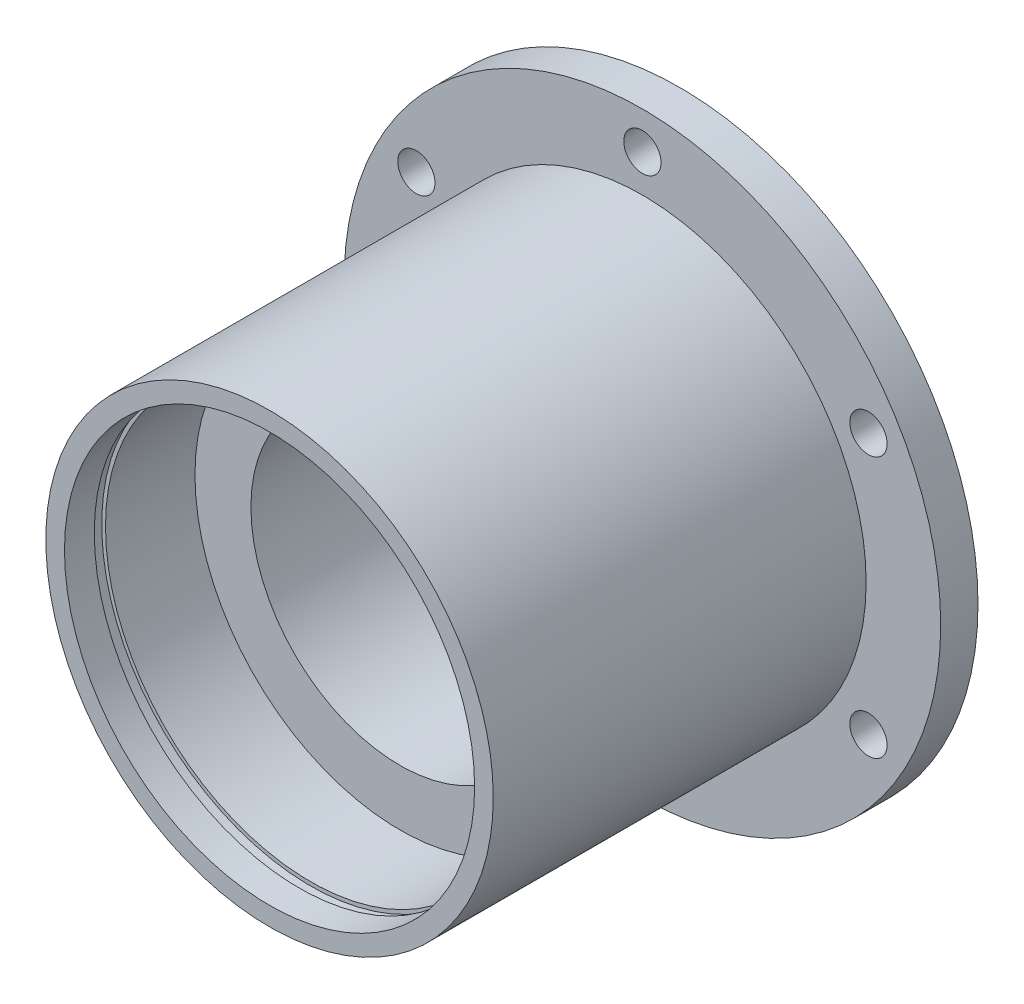
ISO-10303-21;
HEADER;
FILE_DESCRIPTION(('STEP AP214'),'2;1');
FILE_NAME('part.step','',(''),(''),'','','');
FILE_SCHEMA(('AUTOMOTIVE_DESIGN { 1 0 10303 214 1 1 1 1 }'));
ENDSEC;
DATA;
#1=APPLICATION_CONTEXT('core data for automotive mechanical design processes');
#2=APPLICATION_PROTOCOL_DEFINITION('international standard','automotive_design',2000,#1);
#3=PRODUCT_CONTEXT('',#1,'mechanical');
#4=PRODUCT('Part','Part','',(#3));
#5=PRODUCT_RELATED_PRODUCT_CATEGORY('part','',(#4));
#6=PRODUCT_DEFINITION_FORMATION('','',#4);
#7=PRODUCT_DEFINITION_CONTEXT('part definition',#1,'design');
#8=PRODUCT_DEFINITION('design','',#6,#7);
#9=PRODUCT_DEFINITION_SHAPE('','',#8);
#10=(LENGTH_UNIT() NAMED_UNIT(*) SI_UNIT(.MILLI.,.METRE.));
#11=(NAMED_UNIT(*) PLANE_ANGLE_UNIT() SI_UNIT($,.RADIAN.));
#12=(NAMED_UNIT(*) SI_UNIT($,.STERADIAN.) SOLID_ANGLE_UNIT());
#13=UNCERTAINTY_MEASURE_WITH_UNIT(LENGTH_MEASURE(1.E-05),#10,'distance_accuracy_value','');
#14=(GEOMETRIC_REPRESENTATION_CONTEXT(3) GLOBAL_UNCERTAINTY_ASSIGNED_CONTEXT((#13)) GLOBAL_UNIT_ASSIGNED_CONTEXT((#10,
#11,#12)) REPRESENTATION_CONTEXT('',''));
#15=CARTESIAN_POINT('',(0.,0.,0.));
#16=DIRECTION('',(0.,0.,1.));
#17=DIRECTION('',(1.,0.,0.));
#18=AXIS2_PLACEMENT_3D('',#15,#16,#17);
#19=CARTESIAN_POINT('',(0.,0.,55.));
#20=DIRECTION('',(0.,0.,-1.));
#21=DIRECTION('',(-1.,0.,0.));
#22=AXIS2_PLACEMENT_3D('',#19,#20,#21);
#23=CYLINDRICAL_SURFACE('',#22,27.5);
#24=CARTESIAN_POINT('',(0.,0.,37.5));
#25=DIRECTION('',(0.,0.,-1.));
#26=DIRECTION('',(-1.,0.,0.));
#27=AXIS2_PLACEMENT_3D('',#24,#25,#26);
#28=CIRCLE('',#27,27.5);
#29=CARTESIAN_POINT('',(-27.5,0.,37.5));
#30=VERTEX_POINT('',#29);
#31=EDGE_CURVE('E80',#30,#30,#28,.T.);
#32=ORIENTED_EDGE('',*,*,#31,.T.);
#33=EDGE_LOOP('',(#32));
#34=FACE_BOUND('',#33,.T.);
#35=CARTESIAN_POINT('',(0.,0.,49.5));
#36=DIRECTION('',(0.,0.,1.));
#37=DIRECTION('',(1.,0.,0.));
#38=AXIS2_PLACEMENT_3D('',#35,#36,#37);
#39=CIRCLE('',#38,27.5);
#40=CARTESIAN_POINT('',(27.5,0.,49.5));
#41=VERTEX_POINT('',#40);
#42=EDGE_CURVE('E36',#41,#41,#39,.T.);
#43=ORIENTED_EDGE('',*,*,#42,.T.);
#44=EDGE_LOOP('',(#43));
#45=FACE_BOUND('',#44,.T.);
#46=ADVANCED_FACE('F32',(#34,#45),#23,.F.);
#47=CARTESIAN_POINT('',(0.,0.,17.5));
#48=DIRECTION('',(0.,0.,-1.));
#49=DIRECTION('',(-1.,0.,0.));
#50=AXIS2_PLACEMENT_3D('',#47,#48,#49);
#51=CIRCLE('',#50,27.5);
#52=CARTESIAN_POINT('',(-27.5,0.,17.5));
#53=VERTEX_POINT('',#52);
#54=EDGE_CURVE('E11',#53,#53,#51,.T.);
#55=ORIENTED_EDGE('',*,*,#54,.F.);
#56=EDGE_LOOP('',(#55));
#57=FACE_BOUND('',#56,.T.);
#58=CARTESIAN_POINT('',(0.,0.,5.5));
#59=DIRECTION('',(0.,0.,-1.));
#60=DIRECTION('',(-1.,0.,0.));
#61=AXIS2_PLACEMENT_3D('',#58,#59,#60);
#62=CIRCLE('',#61,27.5);
#63=CARTESIAN_POINT('',(-27.5,0.,5.5));
#64=VERTEX_POINT('',#63);
#65=EDGE_CURVE('E52',#64,#64,#62,.T.);
#66=ORIENTED_EDGE('',*,*,#65,.T.);
#67=EDGE_LOOP('',(#66));
#68=FACE_BOUND('',#67,.T.);
#69=ADVANCED_FACE('F150',(#57,#68),#23,.F.);
#70=CARTESIAN_POINT('',(0.,0.,0.));
#71=DIRECTION('',(0.,0.,-1.));
#72=DIRECTION('',(-1.,0.,0.));
#73=AXIS2_PLACEMENT_3D('',#70,#71,#72);
#74=CIRCLE('',#73,27.5);
#75=CARTESIAN_POINT('',(-27.5,0.,0.));
#76=VERTEX_POINT('',#75);
#77=EDGE_CURVE('E83',#76,#76,#74,.T.);
#78=ORIENTED_EDGE('',*,*,#77,.T.);
#79=EDGE_LOOP('',(#78));
#80=FACE_BOUND('',#79,.T.);
#81=CARTESIAN_POINT('',(0.,0.,4.));
#82=DIRECTION('',(0.,0.,1.));
#83=DIRECTION('',(1.,0.,0.));
#84=AXIS2_PLACEMENT_3D('',#81,#82,#83);
#85=CIRCLE('',#84,27.5);
#86=CARTESIAN_POINT('',(27.5,0.,4.));
#87=VERTEX_POINT('',#86);
#88=EDGE_CURVE('E49',#87,#87,#85,.T.);
#89=ORIENTED_EDGE('',*,*,#88,.T.);
#90=EDGE_LOOP('',(#89));
#91=FACE_BOUND('',#90,.T.);
#92=ADVANCED_FACE('F153',(#80,#91),#23,.F.);
#93=CARTESIAN_POINT('',(0.,0.,51.));
#94=DIRECTION('',(0.,0.,1.));
#95=DIRECTION('',(1.,0.,0.));
#96=AXIS2_PLACEMENT_3D('',#93,#94,#95);
#97=CIRCLE('',#96,27.5);
#98=CARTESIAN_POINT('',(27.5,0.,51.));
#99=VERTEX_POINT('',#98);
#100=EDGE_CURVE('E56',#99,#99,#97,.T.);
#101=ORIENTED_EDGE('',*,*,#100,.F.);
#102=EDGE_LOOP('',(#101));
#103=FACE_BOUND('',#102,.T.);
#104=CARTESIAN_POINT('',(0.,0.,55.));
#105=DIRECTION('',(0.,0.,1.));
#106=DIRECTION('',(1.,0.,0.));
#107=AXIS2_PLACEMENT_3D('',#104,#105,#106);
#108=CIRCLE('',#107,27.5);
#109=CARTESIAN_POINT('',(27.5,0.,55.));
#110=VERTEX_POINT('',#109);
#111=EDGE_CURVE('E86',#110,#110,#108,.T.);
#112=ORIENTED_EDGE('',*,*,#111,.T.);
#113=EDGE_LOOP('',(#112));
#114=FACE_BOUND('',#113,.T.);
#115=ADVANCED_FACE('F158',(#103,#114),#23,.F.);
#116=CARTESIAN_POINT('',(0.,0.,5.));
#117=DIRECTION('',(0.,0.,1.));
#118=DIRECTION('',(1.,0.,0.));
#119=AXIS2_PLACEMENT_3D('',#116,#117,#118);
#120=PLANE('',#119);
#121=CARTESIAN_POINT('',(0.,0.,5.));
#122=DIRECTION('',(0.,0.,1.));
#123=DIRECTION('',(1.,0.,0.));
#124=AXIS2_PLACEMENT_3D('',#121,#122,#123);
#125=CIRCLE('',#124,30.);
#126=CARTESIAN_POINT('',(30.,0.,5.));
#127=VERTEX_POINT('',#126);
#128=EDGE_CURVE('E89',#127,#127,#125,.T.);
#129=ORIENTED_EDGE('',*,*,#128,.F.);
#130=EDGE_LOOP('',(#129));
#131=FACE_BOUND('',#130,.T.);
#132=CARTESIAN_POINT('',(-30.3108891324546,-17.5000000000004,5.));
#133=DIRECTION('',(0.,0.,1.));
#134=DIRECTION('',(1.,0.,0.));
#135=AXIS2_PLACEMENT_3D('',#132,#133,#134);
#136=CIRCLE('',#135,2.50000000000114);
#137=CARTESIAN_POINT('',(-27.8108891324535,-17.5000000000004,5.));
#138=VERTEX_POINT('',#137);
#139=EDGE_CURVE('E102',#138,#138,#136,.T.);
#140=ORIENTED_EDGE('',*,*,#139,.F.);
#141=EDGE_LOOP('',(#140));
#142=FACE_BOUND('',#141,.T.);
#143=CARTESIAN_POINT('',(30.3108891324561,-17.4999999999996,5.));
#144=DIRECTION('',(0.,0.,1.));
#145=DIRECTION('',(1.,0.,0.));
#146=AXIS2_PLACEMENT_3D('',#143,#144,#145);
#147=CIRCLE('',#146,2.50000000000075);
#148=CARTESIAN_POINT('',(32.8108891324568,-17.4999999999996,5.));
#149=VERTEX_POINT('',#148);
#150=EDGE_CURVE('E114',#149,#149,#147,.T.);
#151=ORIENTED_EDGE('',*,*,#150,.F.);
#152=EDGE_LOOP('',(#151));
#153=FACE_BOUND('',#152,.T.);
#154=CARTESIAN_POINT('',(0.,35.,5.));
#155=DIRECTION('',(0.,0.,1.));
#156=DIRECTION('',(1.,0.,0.));
#157=AXIS2_PLACEMENT_3D('',#154,#155,#156);
#158=CIRCLE('',#157,2.5);
#159=CARTESIAN_POINT('',(2.5,35.,5.));
#160=VERTEX_POINT('',#159);
#161=EDGE_CURVE('E126',#160,#160,#158,.T.);
#162=ORIENTED_EDGE('',*,*,#161,.F.);
#163=EDGE_LOOP('',(#162));
#164=FACE_BOUND('',#163,.T.);
#165=CARTESIAN_POINT('',(0.,0.,5.));
#166=DIRECTION('',(0.,0.,1.));
#167=DIRECTION('',(1.,0.,0.));
#168=AXIS2_PLACEMENT_3D('',#165,#166,#167);
#169=CIRCLE('',#168,40.);
#170=CARTESIAN_POINT('',(40.,0.,5.));
#171=VERTEX_POINT('',#170);
#172=EDGE_CURVE('E40',#171,#171,#169,.T.);
#173=ORIENTED_EDGE('',*,*,#172,.T.);
#174=EDGE_LOOP('',(#173));
#175=FACE_BOUND('',#174,.T.);
#176=CARTESIAN_POINT('',(30.3108891324554,17.4999999999999,5.));
#177=DIRECTION('',(0.,0.,1.));
#178=DIRECTION('',(1.,0.,0.));
#179=AXIS2_PLACEMENT_3D('',#176,#177,#178);
#180=CIRCLE('',#179,2.5);
#181=CARTESIAN_POINT('',(32.8108891324554,17.4999999999999,5.));
#182=VERTEX_POINT('',#181);
#183=EDGE_CURVE('E120',#182,#182,#180,.T.);
#184=ORIENTED_EDGE('',*,*,#183,.F.);
#185=EDGE_LOOP('',(#184));
#186=FACE_BOUND('',#185,.T.);
#187=CARTESIAN_POINT('',(9.81166250593605E-13,-35.,5.));
#188=DIRECTION('',(0.,0.,1.));
#189=DIRECTION('',(1.,0.,0.));
#190=AXIS2_PLACEMENT_3D('',#187,#188,#189);
#191=CIRCLE('',#190,2.50000000000118);
#192=CARTESIAN_POINT('',(2.50000000000216,-35.,5.));
#193=VERTEX_POINT('',#192);
#194=EDGE_CURVE('E108',#193,#193,#191,.T.);
#195=ORIENTED_EDGE('',*,*,#194,.F.);
#196=EDGE_LOOP('',(#195));
#197=FACE_BOUND('',#196,.T.);
#198=CARTESIAN_POINT('',(-30.3108891324552,17.5000000000004,5.));
#199=DIRECTION('',(0.,0.,1.));
#200=DIRECTION('',(1.,0.,0.));
#201=AXIS2_PLACEMENT_3D('',#198,#199,#200);
#202=CIRCLE('',#201,2.5);
#203=CARTESIAN_POINT('',(-27.8108891324551,17.5000000000004,5.));
#204=VERTEX_POINT('',#203);
#205=EDGE_CURVE('E96',#204,#204,#202,.T.);
#206=ORIENTED_EDGE('',*,*,#205,.F.);
#207=EDGE_LOOP('',(#206));
#208=FACE_BOUND('',#207,.T.);
#209=ADVANCED_FACE('F167',(#131,#142,#153,#164,#175,#186,#197,#208),#120,.T.);
#210=CARTESIAN_POINT('',(0.,0.,0.));
#211=DIRECTION('',(0.,0.,1.));
#212=DIRECTION('',(1.,0.,0.));
#213=AXIS2_PLACEMENT_3D('',#210,#211,#212);
#214=PLANE('',#213);
#215=ORIENTED_EDGE('',*,*,#77,.F.);
#216=EDGE_LOOP('',(#215));
#217=FACE_BOUND('',#216,.T.);
#218=CARTESIAN_POINT('',(0.,0.,0.));
#219=DIRECTION('',(0.,0.,1.));
#220=DIRECTION('',(1.,0.,0.));
#221=AXIS2_PLACEMENT_3D('',#218,#219,#220);
#222=CIRCLE('',#221,40.);
#223=CARTESIAN_POINT('',(40.,0.,0.));
#224=VERTEX_POINT('',#223);
#225=EDGE_CURVE('E45',#224,#224,#222,.T.);
#226=ORIENTED_EDGE('',*,*,#225,.F.);
#227=EDGE_LOOP('',(#226));
#228=FACE_BOUND('',#227,.T.);
#229=CARTESIAN_POINT('',(0.,35.,0.));
#230=DIRECTION('',(0.,0.,1.));
#231=DIRECTION('',(1.,0.,0.));
#232=AXIS2_PLACEMENT_3D('',#229,#230,#231);
#233=CIRCLE('',#232,2.5);
#234=CARTESIAN_POINT('',(2.5,35.,0.));
#235=VERTEX_POINT('',#234);
#236=EDGE_CURVE('E123',#235,#235,#233,.T.);
#237=ORIENTED_EDGE('',*,*,#236,.T.);
#238=EDGE_LOOP('',(#237));
#239=FACE_BOUND('',#238,.T.);
#240=CARTESIAN_POINT('',(30.3108891324554,17.4999999999999,0.));
#241=DIRECTION('',(0.,0.,1.));
#242=DIRECTION('',(1.,0.,0.));
#243=AXIS2_PLACEMENT_3D('',#240,#241,#242);
#244=CIRCLE('',#243,2.5);
#245=CARTESIAN_POINT('',(32.8108891324554,17.4999999999999,0.));
#246=VERTEX_POINT('',#245);
#247=EDGE_CURVE('E117',#246,#246,#244,.T.);
#248=ORIENTED_EDGE('',*,*,#247,.T.);
#249=EDGE_LOOP('',(#248));
#250=FACE_BOUND('',#249,.T.);
#251=CARTESIAN_POINT('',(30.3108891324561,-17.4999999999996,0.));
#252=DIRECTION('',(0.,0.,1.));
#253=DIRECTION('',(1.,0.,0.));
#254=AXIS2_PLACEMENT_3D('',#251,#252,#253);
#255=CIRCLE('',#254,2.50000000000075);
#256=CARTESIAN_POINT('',(32.8108891324568,-17.4999999999996,0.));
#257=VERTEX_POINT('',#256);
#258=EDGE_CURVE('E111',#257,#257,#255,.T.);
#259=ORIENTED_EDGE('',*,*,#258,.T.);
#260=EDGE_LOOP('',(#259));
#261=FACE_BOUND('',#260,.T.);
#262=CARTESIAN_POINT('',(9.81166250593605E-13,-35.,0.));
#263=DIRECTION('',(0.,0.,1.));
#264=DIRECTION('',(1.,0.,0.));
#265=AXIS2_PLACEMENT_3D('',#262,#263,#264);
#266=CIRCLE('',#265,2.50000000000118);
#267=CARTESIAN_POINT('',(2.50000000000216,-35.,0.));
#268=VERTEX_POINT('',#267);
#269=EDGE_CURVE('E105',#268,#268,#266,.T.);
#270=ORIENTED_EDGE('',*,*,#269,.T.);
#271=EDGE_LOOP('',(#270));
#272=FACE_BOUND('',#271,.T.);
#273=CARTESIAN_POINT('',(-30.3108891324546,-17.5000000000004,0.));
#274=DIRECTION('',(0.,0.,1.));
#275=DIRECTION('',(1.,0.,0.));
#276=AXIS2_PLACEMENT_3D('',#273,#274,#275);
#277=CIRCLE('',#276,2.50000000000114);
#278=CARTESIAN_POINT('',(-27.8108891324535,-17.5000000000004,0.));
#279=VERTEX_POINT('',#278);
#280=EDGE_CURVE('E99',#279,#279,#277,.T.);
#281=ORIENTED_EDGE('',*,*,#280,.T.);
#282=EDGE_LOOP('',(#281));
#283=FACE_BOUND('',#282,.T.);
#284=CARTESIAN_POINT('',(-30.3108891324552,17.5000000000004,0.));
#285=DIRECTION('',(0.,0.,1.));
#286=DIRECTION('',(1.,0.,0.));
#287=AXIS2_PLACEMENT_3D('',#284,#285,#286);
#288=CIRCLE('',#287,2.5);
#289=CARTESIAN_POINT('',(-27.8108891324551,17.5000000000004,0.));
#290=VERTEX_POINT('',#289);
#291=EDGE_CURVE('E93',#290,#290,#288,.T.);
#292=ORIENTED_EDGE('',*,*,#291,.T.);
#293=EDGE_LOOP('',(#292));
#294=FACE_BOUND('',#293,.T.);
#295=ADVANCED_FACE('F132',(#217,#228,#239,#250,#261,#272,#283,#294),#214,.F.);
#296=CARTESIAN_POINT('',(0.,0.,5.));
#297=DIRECTION('',(0.,0.,-1.));
#298=DIRECTION('',(-1.,0.,0.));
#299=AXIS2_PLACEMENT_3D('',#296,#297,#298);
#300=CYLINDRICAL_SURFACE('',#299,40.);
#301=ORIENTED_EDGE('',*,*,#172,.F.);
#302=EDGE_LOOP('',(#301));
#303=FACE_BOUND('',#302,.T.);
#304=ORIENTED_EDGE('',*,*,#225,.T.);
#305=EDGE_LOOP('',(#304));
#306=FACE_BOUND('',#305,.T.);
#307=ADVANCED_FACE('F34',(#303,#306),#300,.T.);
#308=CARTESIAN_POINT('',(0.,35.,5.));
#309=DIRECTION('',(0.,0.,-1.));
#310=DIRECTION('',(-1.,0.,0.));
#311=AXIS2_PLACEMENT_3D('',#308,#309,#310);
#312=CYLINDRICAL_SURFACE('',#311,2.5);
#313=ORIENTED_EDGE('',*,*,#161,.T.);
#314=EDGE_LOOP('',(#313));
#315=FACE_BOUND('',#314,.T.);
#316=ORIENTED_EDGE('',*,*,#236,.F.);
#317=EDGE_LOOP('',(#316));
#318=FACE_BOUND('',#317,.T.);
#319=ADVANCED_FACE('F135',(#315,#318),#312,.F.);
#320=CARTESIAN_POINT('',(30.3108891324554,17.4999999999999,5.));
#321=DIRECTION('',(0.,0.,-1.));
#322=DIRECTION('',(-1.,0.,0.));
#323=AXIS2_PLACEMENT_3D('',#320,#321,#322);
#324=CYLINDRICAL_SURFACE('',#323,2.5);
#325=ORIENTED_EDGE('',*,*,#183,.T.);
#326=EDGE_LOOP('',(#325));
#327=FACE_BOUND('',#326,.T.);
#328=ORIENTED_EDGE('',*,*,#247,.F.);
#329=EDGE_LOOP('',(#328));
#330=FACE_BOUND('',#329,.T.);
#331=ADVANCED_FACE('F137',(#327,#330),#324,.F.);
#332=CARTESIAN_POINT('',(30.3108891324561,-17.4999999999996,5.));
#333=DIRECTION('',(0.,0.,-1.));
#334=DIRECTION('',(-1.,0.,0.));
#335=AXIS2_PLACEMENT_3D('',#332,#333,#334);
#336=CYLINDRICAL_SURFACE('',#335,2.50000000000075);
#337=ORIENTED_EDGE('',*,*,#150,.T.);
#338=EDGE_LOOP('',(#337));
#339=FACE_BOUND('',#338,.T.);
#340=ORIENTED_EDGE('',*,*,#258,.F.);
#341=EDGE_LOOP('',(#340));
#342=FACE_BOUND('',#341,.T.);
#343=ADVANCED_FACE('F144',(#339,#342),#336,.F.);
#344=CARTESIAN_POINT('',(9.81166250593605E-13,-35.,5.));
#345=DIRECTION('',(0.,0.,-1.));
#346=DIRECTION('',(-1.,0.,0.));
#347=AXIS2_PLACEMENT_3D('',#344,#345,#346);
#348=CYLINDRICAL_SURFACE('',#347,2.50000000000118);
#349=ORIENTED_EDGE('',*,*,#194,.T.);
#350=EDGE_LOOP('',(#349));
#351=FACE_BOUND('',#350,.T.);
#352=ORIENTED_EDGE('',*,*,#269,.F.);
#353=EDGE_LOOP('',(#352));
#354=FACE_BOUND('',#353,.T.);
#355=ADVANCED_FACE('F231',(#351,#354),#348,.F.);
#356=CARTESIAN_POINT('',(-30.3108891324546,-17.5000000000004,5.));
#357=DIRECTION('',(0.,0.,-1.));
#358=DIRECTION('',(-1.,0.,0.));
#359=AXIS2_PLACEMENT_3D('',#356,#357,#358);
#360=CYLINDRICAL_SURFACE('',#359,2.50000000000114);
#361=ORIENTED_EDGE('',*,*,#139,.T.);
#362=EDGE_LOOP('',(#361));
#363=FACE_BOUND('',#362,.T.);
#364=ORIENTED_EDGE('',*,*,#280,.F.);
#365=EDGE_LOOP('',(#364));
#366=FACE_BOUND('',#365,.T.);
#367=ADVANCED_FACE('F227',(#363,#366),#360,.F.);
#368=CARTESIAN_POINT('',(-30.3108891324552,17.5000000000004,5.));
#369=DIRECTION('',(0.,0.,-1.));
#370=DIRECTION('',(-1.,0.,0.));
#371=AXIS2_PLACEMENT_3D('',#368,#369,#370);
#372=CYLINDRICAL_SURFACE('',#371,2.5);
#373=ORIENTED_EDGE('',*,*,#205,.T.);
#374=EDGE_LOOP('',(#373));
#375=FACE_BOUND('',#374,.T.);
#376=ORIENTED_EDGE('',*,*,#291,.F.);
#377=EDGE_LOOP('',(#376));
#378=FACE_BOUND('',#377,.T.);
#379=ADVANCED_FACE('F220',(#375,#378),#372,.F.);
#380=CARTESIAN_POINT('',(0.,0.,55.));
#381=DIRECTION('',(0.,0.,1.));
#382=DIRECTION('',(1.,0.,0.));
#383=AXIS2_PLACEMENT_3D('',#380,#381,#382);
#384=PLANE('',#383);
#385=CARTESIAN_POINT('',(0.,0.,55.));
#386=DIRECTION('',(0.,0.,1.));
#387=DIRECTION('',(1.,0.,0.));
#388=AXIS2_PLACEMENT_3D('',#385,#386,#387);
#389=CIRCLE('',#388,30.);
#390=CARTESIAN_POINT('',(30.,0.,55.));
#391=VERTEX_POINT('',#390);
#392=EDGE_CURVE('E90',#391,#391,#389,.T.);
#393=ORIENTED_EDGE('',*,*,#392,.T.);
#394=EDGE_LOOP('',(#393));
#395=FACE_BOUND('',#394,.T.);
#396=ORIENTED_EDGE('',*,*,#111,.F.);
#397=EDGE_LOOP('',(#396));
#398=FACE_BOUND('',#397,.T.);
#399=ADVANCED_FACE('F208',(#395,#398),#384,.T.);
#400=CARTESIAN_POINT('',(0.,0.,55.));
#401=DIRECTION('',(0.,0.,-1.));
#402=DIRECTION('',(-1.,0.,0.));
#403=AXIS2_PLACEMENT_3D('',#400,#401,#402);
#404=CYLINDRICAL_SURFACE('',#403,30.);
#405=ORIENTED_EDGE('',*,*,#392,.F.);
#406=EDGE_LOOP('',(#405));
#407=FACE_BOUND('',#406,.T.);
#408=ORIENTED_EDGE('',*,*,#128,.T.);
#409=EDGE_LOOP('',(#408));
#410=FACE_BOUND('',#409,.T.);
#411=ADVANCED_FACE('F203',(#407,#410),#404,.T.);
#412=CARTESIAN_POINT('',(0.,0.,37.5));
#413=DIRECTION('',(0.,0.,-1.));
#414=DIRECTION('',(-1.,0.,0.));
#415=AXIS2_PLACEMENT_3D('',#412,#413,#414);
#416=PLANE('',#415);
#417=CARTESIAN_POINT('',(0.,0.,37.5));
#418=DIRECTION('',(0.,0.,-1.));
#419=DIRECTION('',(-1.,0.,0.));
#420=AXIS2_PLACEMENT_3D('',#417,#418,#419);
#421=CIRCLE('',#420,20.);
#422=CARTESIAN_POINT('',(-20.,0.,37.5));
#423=VERTEX_POINT('',#422);
#424=EDGE_CURVE('E77',#423,#423,#421,.T.);
#425=ORIENTED_EDGE('',*,*,#424,.T.);
#426=EDGE_LOOP('',(#425));
#427=FACE_BOUND('',#426,.T.);
#428=ORIENTED_EDGE('',*,*,#31,.F.);
#429=EDGE_LOOP('',(#428));
#430=FACE_BOUND('',#429,.T.);
#431=ADVANCED_FACE('F200',(#427,#430),#416,.F.);
#432=CARTESIAN_POINT('',(0.,0.,37.5));
#433=DIRECTION('',(0.,0.,-1.));
#434=DIRECTION('',(-1.,0.,0.));
#435=AXIS2_PLACEMENT_3D('',#432,#433,#434);
#436=CYLINDRICAL_SURFACE('',#435,20.);
#437=ORIENTED_EDGE('',*,*,#424,.F.);
#438=EDGE_LOOP('',(#437));
#439=FACE_BOUND('',#438,.T.);
#440=CARTESIAN_POINT('',(0.,0.,17.5));
#441=DIRECTION('',(0.,0.,-1.));
#442=DIRECTION('',(-1.,0.,0.));
#443=AXIS2_PLACEMENT_3D('',#440,#441,#442);
#444=CIRCLE('',#443,20.);
#445=CARTESIAN_POINT('',(-20.,0.,17.5));
#446=VERTEX_POINT('',#445);
#447=EDGE_CURVE('E55',#446,#446,#444,.T.);
#448=ORIENTED_EDGE('',*,*,#447,.T.);
#449=EDGE_LOOP('',(#448));
#450=FACE_BOUND('',#449,.T.);
#451=ADVANCED_FACE('F194',(#439,#450),#436,.F.);
#452=CARTESIAN_POINT('',(0.,0.,17.5));
#453=DIRECTION('',(0.,0.,-1.));
#454=DIRECTION('',(-1.,0.,0.));
#455=AXIS2_PLACEMENT_3D('',#452,#453,#454);
#456=PLANE('',#455);
#457=ORIENTED_EDGE('',*,*,#54,.T.);
#458=EDGE_LOOP('',(#457));
#459=FACE_BOUND('',#458,.T.);
#460=ORIENTED_EDGE('',*,*,#447,.F.);
#461=EDGE_LOOP('',(#460));
#462=FACE_BOUND('',#461,.T.);
#463=ADVANCED_FACE('F188',(#459,#462),#456,.T.);
#464=CARTESIAN_POINT('',(0.,0.,5.5));
#465=DIRECTION('',(0.,0.,-1.));
#466=DIRECTION('',(-1.,0.,0.));
#467=AXIS2_PLACEMENT_3D('',#464,#465,#466);
#468=PLANE('',#467);
#469=ORIENTED_EDGE('',*,*,#65,.F.);
#470=EDGE_LOOP('',(#469));
#471=FACE_BOUND('',#470,.T.);
#472=CARTESIAN_POINT('',(0.,0.,5.5));
#473=DIRECTION('',(0.,0.,-1.));
#474=DIRECTION('',(-1.,0.,0.));
#475=AXIS2_PLACEMENT_3D('',#472,#473,#474);
#476=CIRCLE('',#475,28.);
#477=CARTESIAN_POINT('',(-28.,0.,5.5));
#478=VERTEX_POINT('',#477);
#479=EDGE_CURVE('E62',#478,#478,#476,.T.);
#480=ORIENTED_EDGE('',*,*,#479,.T.);
#481=EDGE_LOOP('',(#480));
#482=FACE_BOUND('',#481,.T.);
#483=ADVANCED_FACE('F183',(#471,#482),#468,.T.);
#484=CARTESIAN_POINT('',(0.,0.,-79.1959594928933));
#485=DIRECTION('',(0.,0.,1.));
#486=DIRECTION('',(1.,0.,0.));
#487=AXIS2_PLACEMENT_3D('',#484,#485,#486);
#488=CYLINDRICAL_SURFACE('',#487,28.);
#489=CARTESIAN_POINT('',(0.,0.,4.));
#490=DIRECTION('',(0.,0.,1.));
#491=DIRECTION('',(1.,0.,0.));
#492=AXIS2_PLACEMENT_3D('',#489,#490,#491);
#493=CIRCLE('',#492,28.);
#494=CARTESIAN_POINT('',(28.,0.,4.));
#495=VERTEX_POINT('',#494);
#496=EDGE_CURVE('E53',#495,#495,#493,.T.);
#497=ORIENTED_EDGE('',*,*,#496,.F.);
#498=EDGE_LOOP('',(#497));
#499=FACE_BOUND('',#498,.T.);
#500=ORIENTED_EDGE('',*,*,#479,.F.);
#501=EDGE_LOOP('',(#500));
#502=FACE_BOUND('',#501,.T.);
#503=ADVANCED_FACE('F177',(#499,#502),#488,.F.);
#504=CARTESIAN_POINT('',(0.,0.,4.));
#505=DIRECTION('',(0.,0.,1.));
#506=DIRECTION('',(1.,0.,0.));
#507=AXIS2_PLACEMENT_3D('',#504,#505,#506);
#508=PLANE('',#507);
#509=ORIENTED_EDGE('',*,*,#88,.F.);
#510=EDGE_LOOP('',(#509));
#511=FACE_BOUND('',#510,.T.);
#512=ORIENTED_EDGE('',*,*,#496,.T.);
#513=EDGE_LOOP('',(#512));
#514=FACE_BOUND('',#513,.T.);
#515=ADVANCED_FACE('F173',(#511,#514),#508,.T.);
#516=CARTESIAN_POINT('',(0.,0.,134.195959492893));
#517=DIRECTION('',(0.,0.,-1.));
#518=DIRECTION('',(-1.,0.,0.));
#519=AXIS2_PLACEMENT_3D('',#516,#517,#518);
#520=CYLINDRICAL_SURFACE('',#519,28.);
#521=CARTESIAN_POINT('',(0.,0.,49.5));
#522=DIRECTION('',(0.,0.,1.));
#523=DIRECTION('',(1.,0.,0.));
#524=AXIS2_PLACEMENT_3D('',#521,#522,#523);
#525=CIRCLE('',#524,28.);
#526=CARTESIAN_POINT('',(28.,0.,49.5));
#527=VERTEX_POINT('',#526);
#528=EDGE_CURVE('E64',#527,#527,#525,.T.);
#529=ORIENTED_EDGE('',*,*,#528,.F.);
#530=EDGE_LOOP('',(#529));
#531=FACE_BOUND('',#530,.T.);
#532=CARTESIAN_POINT('',(0.,0.,51.));
#533=DIRECTION('',(0.,0.,1.));
#534=DIRECTION('',(1.,0.,0.));
#535=AXIS2_PLACEMENT_3D('',#532,#533,#534);
#536=CIRCLE('',#535,28.);
#537=CARTESIAN_POINT('',(28.,0.,51.));
#538=VERTEX_POINT('',#537);
#539=EDGE_CURVE('E58',#538,#538,#536,.T.);
#540=ORIENTED_EDGE('',*,*,#539,.T.);
#541=EDGE_LOOP('',(#540));
#542=FACE_BOUND('',#541,.T.);
#543=ADVANCED_FACE('F176',(#531,#542),#520,.F.);
#544=CARTESIAN_POINT('',(0.,0.,49.5));
#545=DIRECTION('',(0.,0.,1.));
#546=DIRECTION('',(1.,0.,0.));
#547=AXIS2_PLACEMENT_3D('',#544,#545,#546);
#548=PLANE('',#547);
#549=ORIENTED_EDGE('',*,*,#42,.F.);
#550=EDGE_LOOP('',(#549));
#551=FACE_BOUND('',#550,.T.);
#552=ORIENTED_EDGE('',*,*,#528,.T.);
#553=EDGE_LOOP('',(#552));
#554=FACE_BOUND('',#553,.T.);
#555=ADVANCED_FACE('F301',(#551,#554),#548,.T.);
#556=CARTESIAN_POINT('',(0.,0.,51.));
#557=DIRECTION('',(0.,0.,1.));
#558=DIRECTION('',(1.,0.,0.));
#559=AXIS2_PLACEMENT_3D('',#556,#557,#558);
#560=PLANE('',#559);
#561=ORIENTED_EDGE('',*,*,#100,.T.);
#562=EDGE_LOOP('',(#561));
#563=FACE_BOUND('',#562,.T.);
#564=ORIENTED_EDGE('',*,*,#539,.F.);
#565=EDGE_LOOP('',(#564));
#566=FACE_BOUND('',#565,.T.);
#567=ADVANCED_FACE('F311',(#563,#566),#560,.F.);
#568=CLOSED_SHELL('',(#46,#69,#92,#115,#209,#295,#307,#319,#331,#343,#355,#367,#379,#399,#411,
#431,#451,#463,#483,#503,#515,#543,#555,#567));
#569=MANIFOLD_SOLID_BREP('B2',#568);
#570=ADVANCED_BREP_SHAPE_REPRESENTATION('',(#18,#569),#14);
#571=SHAPE_DEFINITION_REPRESENTATION(#9,#570);
ENDSEC;
END-ISO-10303-21;
